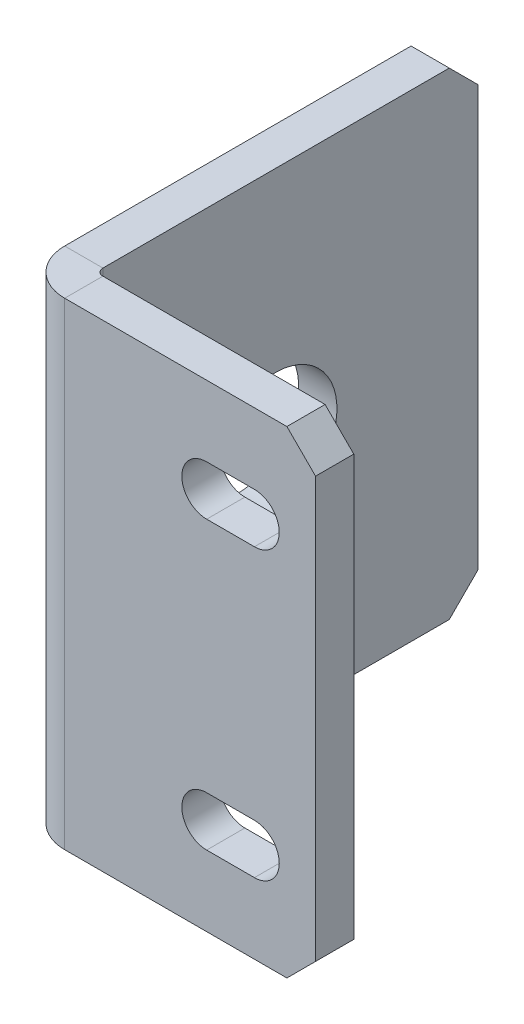
ISO-10303-21;
HEADER;
FILE_DESCRIPTION(('STEP AP214'),'2;1');
FILE_NAME('part.step','',(''),(''),'','','');
FILE_SCHEMA(('AUTOMOTIVE_DESIGN { 1 0 10303 214 1 1 1 1 }'));
ENDSEC;
DATA;
#1=APPLICATION_CONTEXT('core data for automotive mechanical design processes');
#2=APPLICATION_PROTOCOL_DEFINITION('international standard','automotive_design',2000,#1);
#3=PRODUCT_CONTEXT('',#1,'mechanical');
#4=PRODUCT('Part','Part','',(#3));
#5=PRODUCT_RELATED_PRODUCT_CATEGORY('part','',(#4));
#6=PRODUCT_DEFINITION_FORMATION('','',#4);
#7=PRODUCT_DEFINITION_CONTEXT('part definition',#1,'design');
#8=PRODUCT_DEFINITION('design','',#6,#7);
#9=PRODUCT_DEFINITION_SHAPE('','',#8);
#10=(LENGTH_UNIT() NAMED_UNIT(*) SI_UNIT(.MILLI.,.METRE.));
#11=(NAMED_UNIT(*) PLANE_ANGLE_UNIT() SI_UNIT($,.RADIAN.));
#12=(NAMED_UNIT(*) SI_UNIT($,.STERADIAN.) SOLID_ANGLE_UNIT());
#13=UNCERTAINTY_MEASURE_WITH_UNIT(LENGTH_MEASURE(1.E-05),#10,'distance_accuracy_value','');
#14=(GEOMETRIC_REPRESENTATION_CONTEXT(3) GLOBAL_UNCERTAINTY_ASSIGNED_CONTEXT((#13)) GLOBAL_UNIT_ASSIGNED_CONTEXT((#10,
#11,#12)) REPRESENTATION_CONTEXT('',''));
#15=CARTESIAN_POINT('',(0.,0.,0.));
#16=DIRECTION('',(0.,0.,1.));
#17=DIRECTION('',(1.,0.,0.));
#18=AXIS2_PLACEMENT_3D('',#15,#16,#17);
#19=CARTESIAN_POINT('',(0.,50.,-4.7366));
#20=DIRECTION('',(0.,1.,0.));
#21=DIRECTION('',(0.,0.,1.));
#22=AXIS2_PLACEMENT_3D('',#19,#20,#21);
#23=PLANE('',#22);
#24=DIRECTION('',(1.,0.,0.));
#25=VECTOR('',#24,1.);
#26=CARTESIAN_POINT('',(0.,50.,-4.7366));
#27=LINE('',#26,#25);
#28=CARTESIAN_POINT('',(0.,50.,-4.7366));
#29=VERTEX_POINT('',#28);
#30=CARTESIAN_POINT('',(4.,50.,-4.7366));
#31=VERTEX_POINT('',#30);
#32=EDGE_CURVE('E297',#29,#31,#27,.T.);
#33=ORIENTED_EDGE('',*,*,#32,.F.);
#34=CARTESIAN_POINT('',(4.7366,50.,-4.7366));
#35=DIRECTION('',(0.,1.,0.));
#36=DIRECTION('',(0.,0.,1.));
#37=AXIS2_PLACEMENT_3D('',#34,#35,#36);
#38=CIRCLE('',#37,4.7366);
#39=CARTESIAN_POINT('',(4.7366,50.,0.));
#40=VERTEX_POINT('',#39);
#41=EDGE_CURVE('E241',#40,#29,#38,.F.);
#42=ORIENTED_EDGE('',*,*,#41,.F.);
#43=DIRECTION('',(0.,0.,1.));
#44=VECTOR('',#43,1.);
#45=CARTESIAN_POINT('',(4.7366,50.,-4.));
#46=LINE('',#45,#44);
#47=CARTESIAN_POINT('',(4.7366,50.,-4.));
#48=VERTEX_POINT('',#47);
#49=EDGE_CURVE('E294',#48,#40,#46,.T.);
#50=ORIENTED_EDGE('',*,*,#49,.F.);
#51=CARTESIAN_POINT('',(4.7366,50.,-4.7366));
#52=DIRECTION('',(0.,1.,0.));
#53=DIRECTION('',(1.,0.,0.));
#54=AXIS2_PLACEMENT_3D('',#51,#52,#53);
#55=CIRCLE('',#54,0.7366);
#56=EDGE_CURVE('E248',#48,#31,#55,.F.);
#57=ORIENTED_EDGE('',*,*,#56,.T.);
#58=EDGE_LOOP('',(#33,#42,#50,#57));
#59=FACE_BOUND('',#58,.T.);
#60=ADVANCED_FACE('F41',(#59),#23,.T.);
#61=CARTESIAN_POINT('',(4.7366,50.,-4.));
#62=DIRECTION('',(0.,1.,0.));
#63=DIRECTION('',(0.,0.,1.));
#64=AXIS2_PLACEMENT_3D('',#61,#62,#63);
#65=PLANE('',#64);
#66=DIRECTION('',(0.,0.,-1.));
#67=VECTOR('',#66,1.);
#68=CARTESIAN_POINT('',(4.,50.,0.));
#69=LINE('',#68,#67);
#70=CARTESIAN_POINT('',(4.,50.,-41.));
#71=VERTEX_POINT('',#70);
#72=EDGE_CURVE('E234',#31,#71,#69,.T.);
#73=ORIENTED_EDGE('',*,*,#72,.T.);
#74=DIRECTION('',(-1.,0.,0.));
#75=VECTOR('',#74,1.);
#76=CARTESIAN_POINT('',(4.7366,50.,-41.));
#77=LINE('',#76,#75);
#78=CARTESIAN_POINT('',(0.,50.,-41.));
#79=VERTEX_POINT('',#78);
#80=EDGE_CURVE('E308',#71,#79,#77,.T.);
#81=ORIENTED_EDGE('',*,*,#80,.T.);
#82=DIRECTION('',(0.,0.,-1.));
#83=VECTOR('',#82,1.);
#84=CARTESIAN_POINT('',(0.,50.,0.));
#85=LINE('',#84,#83);
#86=EDGE_CURVE('E237',#29,#79,#85,.T.);
#87=ORIENTED_EDGE('',*,*,#86,.F.);
#88=ORIENTED_EDGE('',*,*,#32,.T.);
#89=EDGE_LOOP('',(#73,#81,#87,#88));
#90=FACE_BOUND('',#89,.T.);
#91=ADVANCED_FACE('F371',(#90),#65,.T.);
#92=CARTESIAN_POINT('',(4.7366,0.,0.));
#93=DIRECTION('',(0.,-1.,0.));
#94=DIRECTION('',(0.,0.,-1.));
#95=AXIS2_PLACEMENT_3D('',#92,#93,#94);
#96=PLANE('',#95);
#97=DIRECTION('',(0.,0.,-1.));
#98=VECTOR('',#97,1.);
#99=CARTESIAN_POINT('',(4.7366,0.,0.));
#100=LINE('',#99,#98);
#101=CARTESIAN_POINT('',(4.7366,0.,0.));
#102=VERTEX_POINT('',#101);
#103=CARTESIAN_POINT('',(4.7366,0.,-4.));
#104=VERTEX_POINT('',#103);
#105=EDGE_CURVE('E291',#102,#104,#100,.T.);
#106=ORIENTED_EDGE('',*,*,#105,.F.);
#107=CARTESIAN_POINT('',(4.7366,0.,-4.7366));
#108=DIRECTION('',(0.,1.,0.));
#109=DIRECTION('',(0.,0.,1.));
#110=AXIS2_PLACEMENT_3D('',#107,#108,#109);
#111=CIRCLE('',#110,4.7366);
#112=CARTESIAN_POINT('',(0.,0.,-4.7366));
#113=VERTEX_POINT('',#112);
#114=EDGE_CURVE('E257',#102,#113,#111,.F.);
#115=ORIENTED_EDGE('',*,*,#114,.T.);
#116=DIRECTION('',(-1.,0.,0.));
#117=VECTOR('',#116,1.);
#118=CARTESIAN_POINT('',(4.,0.,-4.7366));
#119=LINE('',#118,#117);
#120=CARTESIAN_POINT('',(4.,0.,-4.7366));
#121=VERTEX_POINT('',#120);
#122=EDGE_CURVE('E289',#121,#113,#119,.T.);
#123=ORIENTED_EDGE('',*,*,#122,.F.);
#124=CARTESIAN_POINT('',(4.7366,0.,-4.7366));
#125=DIRECTION('',(0.,1.,0.));
#126=DIRECTION('',(1.,0.,0.));
#127=AXIS2_PLACEMENT_3D('',#124,#125,#126);
#128=CIRCLE('',#127,0.7366);
#129=EDGE_CURVE('E238',#104,#121,#128,.F.);
#130=ORIENTED_EDGE('',*,*,#129,.F.);
#131=EDGE_LOOP('',(#106,#115,#123,#130));
#132=FACE_BOUND('',#131,.T.);
#133=ADVANCED_FACE('F377',(#132),#96,.T.);
#134=CARTESIAN_POINT('',(4.,0.,-4.7366));
#135=DIRECTION('',(0.,-1.,0.));
#136=DIRECTION('',(0.,0.,-1.));
#137=AXIS2_PLACEMENT_3D('',#134,#135,#136);
#138=PLANE('',#137);
#139=DIRECTION('',(1.,0.,0.));
#140=VECTOR('',#139,1.);
#141=CARTESIAN_POINT('',(0.,0.,-4.));
#142=LINE('',#141,#140);
#143=CARTESIAN_POINT('',(28.,0.,-4.));
#144=VERTEX_POINT('',#143);
#145=EDGE_CURVE('E262',#144,#104,#142,.F.);
#146=ORIENTED_EDGE('',*,*,#145,.F.);
#147=DIRECTION('',(0.,0.,1.));
#148=VECTOR('',#147,1.);
#149=CARTESIAN_POINT('',(28.,0.,-4.7366));
#150=LINE('',#149,#148);
#151=CARTESIAN_POINT('',(28.,0.,0.));
#152=VERTEX_POINT('',#151);
#153=EDGE_CURVE('E332',#144,#152,#150,.T.);
#154=ORIENTED_EDGE('',*,*,#153,.T.);
#155=DIRECTION('',(-1.,0.,0.));
#156=VECTOR('',#155,1.);
#157=CARTESIAN_POINT('',(0.,0.,0.));
#158=LINE('',#157,#156);
#159=EDGE_CURVE('E260',#152,#102,#158,.T.);
#160=ORIENTED_EDGE('',*,*,#159,.T.);
#161=ORIENTED_EDGE('',*,*,#105,.T.);
#162=EDGE_LOOP('',(#146,#154,#160,#161));
#163=FACE_BOUND('',#162,.T.);
#164=ADVANCED_FACE('F422',(#163),#138,.T.);
#165=CARTESIAN_POINT('',(4.,50.,0.));
#166=DIRECTION('',(-1.,0.,0.));
#167=DIRECTION('',(0.,0.,1.));
#168=AXIS2_PLACEMENT_3D('',#165,#166,#167);
#169=PLANE('',#168);
#170=CARTESIAN_POINT('',(4.,25.,-22.7366));
#171=DIRECTION('',(-1.,0.,0.));
#172=DIRECTION('',(0.,0.,1.));
#173=AXIS2_PLACEMENT_3D('',#170,#171,#172);
#174=CIRCLE('',#173,6.50000000000001);
#175=CARTESIAN_POINT('',(4.,25.,-16.2366));
#176=VERTEX_POINT('',#175);
#177=EDGE_CURVE('E230',#176,#176,#174,.T.);
#178=ORIENTED_EDGE('',*,*,#177,.T.);
#179=EDGE_LOOP('',(#178));
#180=FACE_BOUND('',#179,.T.);
#181=DIRECTION('',(0.,-1.,0.));
#182=VECTOR('',#181,1.);
#183=CARTESIAN_POINT('',(4.,50.,-44.));
#184=LINE('',#183,#182);
#185=CARTESIAN_POINT('',(4.,47.,-44.));
#186=VERTEX_POINT('',#185);
#187=CARTESIAN_POINT('',(4.,3.00000000000002,-44.));
#188=VERTEX_POINT('',#187);
#189=EDGE_CURVE('E286',#186,#188,#184,.T.);
#190=ORIENTED_EDGE('',*,*,#189,.F.);
#191=DIRECTION('',(0.,-0.707106781186548,-0.707106781186548));
#192=VECTOR('',#191,1.);
#193=CARTESIAN_POINT('',(4.,47.,-44.));
#194=LINE('',#193,#192);
#195=EDGE_CURVE('E306',#186,#71,#194,.F.);
#196=ORIENTED_EDGE('',*,*,#195,.T.);
#197=ORIENTED_EDGE('',*,*,#72,.F.);
#198=DIRECTION('',(0.,-1.,0.));
#199=VECTOR('',#198,1.);
#200=CARTESIAN_POINT('',(4.,50.,-4.7366));
#201=LINE('',#200,#199);
#202=EDGE_CURVE('E251',#31,#121,#201,.T.);
#203=ORIENTED_EDGE('',*,*,#202,.T.);
#204=DIRECTION('',(0.,0.,-1.));
#205=VECTOR('',#204,1.);
#206=CARTESIAN_POINT('',(4.,0.,0.));
#207=LINE('',#206,#205);
#208=CARTESIAN_POINT('',(4.,0.,-41.));
#209=VERTEX_POINT('',#208);
#210=EDGE_CURVE('E233',#121,#209,#207,.T.);
#211=ORIENTED_EDGE('',*,*,#210,.T.);
#212=DIRECTION('',(0.,0.707106781186548,-0.707106781186547));
#213=VECTOR('',#212,1.);
#214=CARTESIAN_POINT('',(4.,0.,-41.));
#215=LINE('',#214,#213);
#216=EDGE_CURVE('E304',#209,#188,#215,.T.);
#217=ORIENTED_EDGE('',*,*,#216,.T.);
#218=EDGE_LOOP('',(#190,#196,#197,#203,#211,#217));
#219=FACE_BOUND('',#218,.T.);
#220=ADVANCED_FACE('F450',(#180,#219),#169,.F.);
#221=CARTESIAN_POINT('',(0.,50.,-44.));
#222=DIRECTION('',(0.,0.,-1.));
#223=DIRECTION('',(-1.,0.,0.));
#224=AXIS2_PLACEMENT_3D('',#221,#222,#223);
#225=PLANE('',#224);
#226=DIRECTION('',(0.,-1.,0.));
#227=VECTOR('',#226,1.);
#228=CARTESIAN_POINT('',(0.,50.,-44.));
#229=LINE('',#228,#227);
#230=CARTESIAN_POINT('',(0.,47.,-44.));
#231=VERTEX_POINT('',#230);
#232=CARTESIAN_POINT('',(0.,3.00000000000002,-44.));
#233=VERTEX_POINT('',#232);
#234=EDGE_CURVE('E283',#231,#233,#229,.T.);
#235=ORIENTED_EDGE('',*,*,#234,.F.);
#236=DIRECTION('',(1.,0.,0.));
#237=VECTOR('',#236,1.);
#238=CARTESIAN_POINT('',(0.,47.,-44.));
#239=LINE('',#238,#237);
#240=EDGE_CURVE('E301',#231,#186,#239,.T.);
#241=ORIENTED_EDGE('',*,*,#240,.T.);
#242=ORIENTED_EDGE('',*,*,#189,.T.);
#243=DIRECTION('',(-1.,0.,0.));
#244=VECTOR('',#243,1.);
#245=CARTESIAN_POINT('',(0.,3.00000000000002,-44.));
#246=LINE('',#245,#244);
#247=EDGE_CURVE('E299',#188,#233,#246,.T.);
#248=ORIENTED_EDGE('',*,*,#247,.T.);
#249=EDGE_LOOP('',(#235,#241,#242,#248));
#250=FACE_BOUND('',#249,.T.);
#251=ADVANCED_FACE('F456',(#250),#225,.T.);
#252=CARTESIAN_POINT('',(0.,50.,0.));
#253=DIRECTION('',(-1.,0.,0.));
#254=DIRECTION('',(0.,0.,1.));
#255=AXIS2_PLACEMENT_3D('',#252,#253,#254);
#256=PLANE('',#255);
#257=CARTESIAN_POINT('',(0.,25.,-22.7366));
#258=DIRECTION('',(-1.,0.,0.));
#259=DIRECTION('',(0.,0.,1.));
#260=AXIS2_PLACEMENT_3D('',#257,#258,#259);
#261=CIRCLE('',#260,6.50000000000001);
#262=CARTESIAN_POINT('',(0.,25.,-16.2366));
#263=VERTEX_POINT('',#262);
#264=EDGE_CURVE('E221',#263,#263,#261,.T.);
#265=ORIENTED_EDGE('',*,*,#264,.F.);
#266=EDGE_LOOP('',(#265));
#267=FACE_BOUND('',#266,.T.);
#268=ORIENTED_EDGE('',*,*,#86,.T.);
#269=DIRECTION('',(0.,0.707106781186548,0.707106781186548));
#270=VECTOR('',#269,1.);
#271=CARTESIAN_POINT('',(0.,70.5,-20.5));
#272=LINE('',#271,#270);
#273=EDGE_CURVE('E312',#79,#231,#272,.F.);
#274=ORIENTED_EDGE('',*,*,#273,.T.);
#275=ORIENTED_EDGE('',*,*,#234,.T.);
#276=DIRECTION('',(0.,-0.707106781186548,0.707106781186547));
#277=VECTOR('',#276,1.);
#278=CARTESIAN_POINT('',(0.,4.50000000000007,-45.5));
#279=LINE('',#278,#277);
#280=CARTESIAN_POINT('',(0.,0.,-41.));
#281=VERTEX_POINT('',#280);
#282=EDGE_CURVE('E310',#233,#281,#279,.T.);
#283=ORIENTED_EDGE('',*,*,#282,.T.);
#284=DIRECTION('',(0.,0.,-1.));
#285=VECTOR('',#284,1.);
#286=CARTESIAN_POINT('',(0.,0.,0.));
#287=LINE('',#286,#285);
#288=EDGE_CURVE('E254',#113,#281,#287,.T.);
#289=ORIENTED_EDGE('',*,*,#288,.F.);
#290=DIRECTION('',(0.,-1.,0.));
#291=VECTOR('',#290,1.);
#292=CARTESIAN_POINT('',(0.,50.,-4.7366));
#293=LINE('',#292,#291);
#294=EDGE_CURVE('E280',#29,#113,#293,.T.);
#295=ORIENTED_EDGE('',*,*,#294,.F.);
#296=EDGE_LOOP('',(#268,#274,#275,#283,#289,#295));
#297=FACE_BOUND('',#296,.T.);
#298=ADVANCED_FACE('F444',(#267,#297),#256,.T.);
#299=CARTESIAN_POINT('',(4.7366,50.,-4.7366));
#300=DIRECTION('',(0.,-1.,0.));
#301=DIRECTION('',(0.,0.,-1.));
#302=AXIS2_PLACEMENT_3D('',#299,#300,#301);
#303=CYLINDRICAL_SURFACE('',#302,4.7366);
#304=ORIENTED_EDGE('',*,*,#114,.F.);
#305=DIRECTION('',(0.,-1.,0.));
#306=VECTOR('',#305,1.);
#307=CARTESIAN_POINT('',(4.7366,50.,0.));
#308=LINE('',#307,#306);
#309=EDGE_CURVE('E277',#40,#102,#308,.T.);
#310=ORIENTED_EDGE('',*,*,#309,.F.);
#311=ORIENTED_EDGE('',*,*,#41,.T.);
#312=ORIENTED_EDGE('',*,*,#294,.T.);
#313=EDGE_LOOP('',(#304,#310,#311,#312));
#314=FACE_BOUND('',#313,.T.);
#315=ADVANCED_FACE('F439',(#314),#303,.T.);
#316=CARTESIAN_POINT('',(0.,50.,0.));
#317=DIRECTION('',(0.,0.,1.));
#318=DIRECTION('',(1.,0.,0.));
#319=AXIS2_PLACEMENT_3D('',#316,#317,#318);
#320=PLANE('',#319);
#321=CARTESIAN_POINT('',(24.6,40.,0.));
#322=DIRECTION('',(0.,0.,1.));
#323=DIRECTION('',(1.,0.,0.));
#324=AXIS2_PLACEMENT_3D('',#321,#322,#323);
#325=CIRCLE('',#324,2.6);
#326=CARTESIAN_POINT('',(24.6,37.4,0.));
#327=VERTEX_POINT('',#326);
#328=CARTESIAN_POINT('',(24.6,42.6,0.));
#329=VERTEX_POINT('',#328);
#330=EDGE_CURVE('E57',#327,#329,#325,.T.);
#331=ORIENTED_EDGE('',*,*,#330,.F.);
#332=DIRECTION('',(1.,0.,0.));
#333=VECTOR('',#332,1.);
#334=CARTESIAN_POINT('',(24.6,37.4,0.));
#335=LINE('',#334,#333);
#336=CARTESIAN_POINT('',(19.6,37.4,0.));
#337=VERTEX_POINT('',#336);
#338=EDGE_CURVE('E198',#337,#327,#335,.T.);
#339=ORIENTED_EDGE('',*,*,#338,.F.);
#340=CARTESIAN_POINT('',(19.6,40.,0.));
#341=DIRECTION('',(0.,0.,1.));
#342=DIRECTION('',(1.,0.,0.));
#343=AXIS2_PLACEMENT_3D('',#340,#341,#342);
#344=CIRCLE('',#343,2.6);
#345=CARTESIAN_POINT('',(19.6,42.6,0.));
#346=VERTEX_POINT('',#345);
#347=EDGE_CURVE('E182',#346,#337,#344,.T.);
#348=ORIENTED_EDGE('',*,*,#347,.F.);
#349=DIRECTION('',(-1.,0.,0.));
#350=VECTOR('',#349,1.);
#351=CARTESIAN_POINT('',(24.6,42.6,0.));
#352=LINE('',#351,#350);
#353=EDGE_CURVE('E191',#329,#346,#352,.T.);
#354=ORIENTED_EDGE('',*,*,#353,.F.);
#355=EDGE_LOOP('',(#331,#339,#348,#354));
#356=FACE_BOUND('',#355,.T.);
#357=CARTESIAN_POINT('',(24.6,10.,0.));
#358=DIRECTION('',(0.,0.,1.));
#359=DIRECTION('',(1.,0.,0.));
#360=AXIS2_PLACEMENT_3D('',#357,#358,#359);
#361=CIRCLE('',#360,2.6);
#362=CARTESIAN_POINT('',(24.6,7.4,0.));
#363=VERTEX_POINT('',#362);
#364=CARTESIAN_POINT('',(24.6,12.6,0.));
#365=VERTEX_POINT('',#364);
#366=EDGE_CURVE('E205',#363,#365,#361,.T.);
#367=ORIENTED_EDGE('',*,*,#366,.F.);
#368=DIRECTION('',(1.,0.,0.));
#369=VECTOR('',#368,1.);
#370=CARTESIAN_POINT('',(24.6,7.4,0.));
#371=LINE('',#370,#369);
#372=CARTESIAN_POINT('',(19.6,7.4,0.));
#373=VERTEX_POINT('',#372);
#374=EDGE_CURVE('E215',#373,#363,#371,.T.);
#375=ORIENTED_EDGE('',*,*,#374,.F.);
#376=CARTESIAN_POINT('',(19.6,10.,0.));
#377=DIRECTION('',(0.,0.,1.));
#378=DIRECTION('',(1.,0.,0.));
#379=AXIS2_PLACEMENT_3D('',#376,#377,#378);
#380=CIRCLE('',#379,2.6);
#381=CARTESIAN_POINT('',(19.6,12.6,0.));
#382=VERTEX_POINT('',#381);
#383=EDGE_CURVE('E212',#382,#373,#380,.T.);
#384=ORIENTED_EDGE('',*,*,#383,.F.);
#385=DIRECTION('',(-1.,0.,0.));
#386=VECTOR('',#385,1.);
#387=CARTESIAN_POINT('',(24.6,12.6,0.));
#388=LINE('',#387,#386);
#389=EDGE_CURVE('E209',#365,#382,#388,.T.);
#390=ORIENTED_EDGE('',*,*,#389,.F.);
#391=EDGE_LOOP('',(#367,#375,#384,#390));
#392=FACE_BOUND('',#391,.T.);
#393=DIRECTION('',(0.,-1.,0.));
#394=VECTOR('',#393,1.);
#395=CARTESIAN_POINT('',(31.,50.,0.));
#396=LINE('',#395,#394);
#397=CARTESIAN_POINT('',(31.,47.,0.));
#398=VERTEX_POINT('',#397);
#399=CARTESIAN_POINT('',(31.,3.00000000000002,0.));
#400=VERTEX_POINT('',#399);
#401=EDGE_CURVE('E274',#398,#400,#396,.T.);
#402=ORIENTED_EDGE('',*,*,#401,.F.);
#403=DIRECTION('',(0.707106781186548,-0.707106781186547,0.));
#404=VECTOR('',#403,1.);
#405=CARTESIAN_POINT('',(14.,64.,0.));
#406=LINE('',#405,#404);
#407=CARTESIAN_POINT('',(28.,50.,0.));
#408=VERTEX_POINT('',#407);
#409=EDGE_CURVE('E324',#398,#408,#406,.F.);
#410=ORIENTED_EDGE('',*,*,#409,.T.);
#411=DIRECTION('',(-1.,0.,0.));
#412=VECTOR('',#411,1.);
#413=CARTESIAN_POINT('',(0.,50.,0.));
#414=LINE('',#413,#412);
#415=EDGE_CURVE('E244',#408,#40,#414,.T.);
#416=ORIENTED_EDGE('',*,*,#415,.T.);
#417=ORIENTED_EDGE('',*,*,#309,.T.);
#418=ORIENTED_EDGE('',*,*,#159,.F.);
#419=DIRECTION('',(-0.707106781186546,-0.707106781186549,0.));
#420=VECTOR('',#419,1.);
#421=CARTESIAN_POINT('',(39.0000000000001,11.0000000000001,0.));
#422=LINE('',#421,#420);
#423=EDGE_CURVE('E322',#152,#400,#422,.F.);
#424=ORIENTED_EDGE('',*,*,#423,.T.);
#425=EDGE_LOOP('',(#402,#410,#416,#417,#418,#424));
#426=FACE_BOUND('',#425,.T.);
#427=ADVANCED_FACE('F195',(#356,#392,#426),#320,.T.);
#428=CARTESIAN_POINT('',(31.,50.,-4.));
#429=DIRECTION('',(1.,0.,0.));
#430=DIRECTION('',(0.,0.,-1.));
#431=AXIS2_PLACEMENT_3D('',#428,#429,#430);
#432=PLANE('',#431);
#433=DIRECTION('',(0.,-1.,0.));
#434=VECTOR('',#433,1.);
#435=CARTESIAN_POINT('',(31.,50.,-4.));
#436=LINE('',#435,#434);
#437=CARTESIAN_POINT('',(31.,47.,-4.));
#438=VERTEX_POINT('',#437);
#439=CARTESIAN_POINT('',(31.,3.00000000000002,-4.));
#440=VERTEX_POINT('',#439);
#441=EDGE_CURVE('E271',#438,#440,#436,.T.);
#442=ORIENTED_EDGE('',*,*,#441,.F.);
#443=DIRECTION('',(0.,0.,1.));
#444=VECTOR('',#443,1.);
#445=CARTESIAN_POINT('',(31.,47.,-4.));
#446=LINE('',#445,#444);
#447=EDGE_CURVE('E319',#438,#398,#446,.T.);
#448=ORIENTED_EDGE('',*,*,#447,.T.);
#449=ORIENTED_EDGE('',*,*,#401,.T.);
#450=DIRECTION('',(0.,0.,-1.));
#451=VECTOR('',#450,1.);
#452=CARTESIAN_POINT('',(31.,3.00000000000002,-4.));
#453=LINE('',#452,#451);
#454=EDGE_CURVE('E317',#400,#440,#453,.T.);
#455=ORIENTED_EDGE('',*,*,#454,.T.);
#456=EDGE_LOOP('',(#442,#448,#449,#455));
#457=FACE_BOUND('',#456,.T.);
#458=ADVANCED_FACE('F416',(#457),#432,.T.);
#459=CARTESIAN_POINT('',(0.,50.,-4.));
#460=DIRECTION('',(0.,0.,1.));
#461=DIRECTION('',(1.,0.,0.));
#462=AXIS2_PLACEMENT_3D('',#459,#460,#461);
#463=PLANE('',#462);
#464=DIRECTION('',(1.,0.,0.));
#465=VECTOR('',#464,1.);
#466=CARTESIAN_POINT('',(0.,37.4,-4.));
#467=LINE('',#466,#465);
#468=CARTESIAN_POINT('',(19.6,37.4,-4.));
#469=VERTEX_POINT('',#468);
#470=CARTESIAN_POINT('',(24.6,37.4,-4.));
#471=VERTEX_POINT('',#470);
#472=EDGE_CURVE('E50',#469,#471,#467,.T.);
#473=ORIENTED_EDGE('',*,*,#472,.T.);
#474=CARTESIAN_POINT('',(24.6,40.,-4.));
#475=DIRECTION('',(0.,0.,1.));
#476=DIRECTION('',(1.,0.,0.));
#477=AXIS2_PLACEMENT_3D('',#474,#475,#476);
#478=CIRCLE('',#477,2.6);
#479=CARTESIAN_POINT('',(24.6,42.6,-4.));
#480=VERTEX_POINT('',#479);
#481=EDGE_CURVE('E11',#471,#480,#478,.T.);
#482=ORIENTED_EDGE('',*,*,#481,.T.);
#483=DIRECTION('',(-1.,0.,0.));
#484=VECTOR('',#483,1.);
#485=CARTESIAN_POINT('',(0.,42.6,-4.));
#486=LINE('',#485,#484);
#487=CARTESIAN_POINT('',(19.6,42.6,-4.));
#488=VERTEX_POINT('',#487);
#489=EDGE_CURVE('E347',#480,#488,#486,.T.);
#490=ORIENTED_EDGE('',*,*,#489,.T.);
#491=CARTESIAN_POINT('',(19.6,40.,-4.));
#492=DIRECTION('',(0.,0.,1.));
#493=DIRECTION('',(1.,0.,0.));
#494=AXIS2_PLACEMENT_3D('',#491,#492,#493);
#495=CIRCLE('',#494,2.6);
#496=EDGE_CURVE('E185',#488,#469,#495,.T.);
#497=ORIENTED_EDGE('',*,*,#496,.T.);
#498=EDGE_LOOP('',(#473,#482,#490,#497));
#499=FACE_BOUND('',#498,.T.);
#500=DIRECTION('',(1.,0.,0.));
#501=VECTOR('',#500,1.);
#502=CARTESIAN_POINT('',(0.,7.4,-4.));
#503=LINE('',#502,#501);
#504=CARTESIAN_POINT('',(19.6,7.4,-4.));
#505=VERTEX_POINT('',#504);
#506=CARTESIAN_POINT('',(24.6,7.4,-4.));
#507=VERTEX_POINT('',#506);
#508=EDGE_CURVE('E341',#505,#507,#503,.T.);
#509=ORIENTED_EDGE('',*,*,#508,.T.);
#510=CARTESIAN_POINT('',(24.6,10.,-4.));
#511=DIRECTION('',(0.,0.,1.));
#512=DIRECTION('',(1.,0.,0.));
#513=AXIS2_PLACEMENT_3D('',#510,#511,#512);
#514=CIRCLE('',#513,2.6);
#515=CARTESIAN_POINT('',(24.6,12.6,-4.));
#516=VERTEX_POINT('',#515);
#517=EDGE_CURVE('E344',#507,#516,#514,.T.);
#518=ORIENTED_EDGE('',*,*,#517,.T.);
#519=DIRECTION('',(-1.,0.,0.));
#520=VECTOR('',#519,1.);
#521=CARTESIAN_POINT('',(0.,12.6,-4.));
#522=LINE('',#521,#520);
#523=CARTESIAN_POINT('',(19.6,12.6,-4.));
#524=VERTEX_POINT('',#523);
#525=EDGE_CURVE('E335',#516,#524,#522,.T.);
#526=ORIENTED_EDGE('',*,*,#525,.T.);
#527=CARTESIAN_POINT('',(19.6,10.,-4.));
#528=DIRECTION('',(0.,0.,1.));
#529=DIRECTION('',(1.,0.,0.));
#530=AXIS2_PLACEMENT_3D('',#527,#528,#529);
#531=CIRCLE('',#530,2.6);
#532=EDGE_CURVE('E338',#524,#505,#531,.T.);
#533=ORIENTED_EDGE('',*,*,#532,.T.);
#534=EDGE_LOOP('',(#509,#518,#526,#533));
#535=FACE_BOUND('',#534,.T.);
#536=DIRECTION('',(1.,0.,0.));
#537=VECTOR('',#536,1.);
#538=CARTESIAN_POINT('',(0.,50.,-4.));
#539=LINE('',#538,#537);
#540=CARTESIAN_POINT('',(28.,50.,-4.));
#541=VERTEX_POINT('',#540);
#542=EDGE_CURVE('E246',#541,#48,#539,.F.);
#543=ORIENTED_EDGE('',*,*,#542,.F.);
#544=DIRECTION('',(-0.707106781186548,0.707106781186547,0.));
#545=VECTOR('',#544,1.);
#546=CARTESIAN_POINT('',(31.,47.,-4.));
#547=LINE('',#546,#545);
#548=EDGE_CURVE('E330',#541,#438,#547,.F.);
#549=ORIENTED_EDGE('',*,*,#548,.T.);
#550=ORIENTED_EDGE('',*,*,#441,.T.);
#551=DIRECTION('',(0.707106781186546,0.707106781186549,0.));
#552=VECTOR('',#551,1.);
#553=CARTESIAN_POINT('',(28.,0.,-4.));
#554=LINE('',#553,#552);
#555=EDGE_CURVE('E328',#440,#144,#554,.F.);
#556=ORIENTED_EDGE('',*,*,#555,.T.);
#557=ORIENTED_EDGE('',*,*,#145,.T.);
#558=DIRECTION('',(0.,-1.,0.));
#559=VECTOR('',#558,1.);
#560=CARTESIAN_POINT('',(4.7366,50.,-4.));
#561=LINE('',#560,#559);
#562=EDGE_CURVE('E268',#48,#104,#561,.T.);
#563=ORIENTED_EDGE('',*,*,#562,.F.);
#564=EDGE_LOOP('',(#543,#549,#550,#556,#557,#563));
#565=FACE_BOUND('',#564,.T.);
#566=ADVANCED_FACE('F351',(#499,#535,#565),#463,.F.);
#567=CARTESIAN_POINT('',(4.7366,50.,-4.7366));
#568=DIRECTION('',(0.,-1.,0.));
#569=DIRECTION('',(0.,0.,-1.));
#570=AXIS2_PLACEMENT_3D('',#567,#568,#569);
#571=CYLINDRICAL_SURFACE('',#570,0.7366);
#572=ORIENTED_EDGE('',*,*,#129,.T.);
#573=ORIENTED_EDGE('',*,*,#202,.F.);
#574=ORIENTED_EDGE('',*,*,#56,.F.);
#575=ORIENTED_EDGE('',*,*,#562,.T.);
#576=EDGE_LOOP('',(#572,#573,#574,#575));
#577=FACE_BOUND('',#576,.T.);
#578=ADVANCED_FACE('F429',(#577),#571,.F.);
#579=CARTESIAN_POINT('',(4.7366,50.,-4.7366));
#580=DIRECTION('',(0.,1.,0.));
#581=DIRECTION('',(1.,0.,0.));
#582=AXIS2_PLACEMENT_3D('',#579,#580,#581);
#583=PLANE('',#582);
#584=ORIENTED_EDGE('',*,*,#415,.F.);
#585=DIRECTION('',(0.,0.,-1.));
#586=VECTOR('',#585,1.);
#587=CARTESIAN_POINT('',(28.,50.,-4.7366));
#588=LINE('',#587,#586);
#589=EDGE_CURVE('E326',#408,#541,#588,.T.);
#590=ORIENTED_EDGE('',*,*,#589,.T.);
#591=ORIENTED_EDGE('',*,*,#542,.T.);
#592=ORIENTED_EDGE('',*,*,#49,.T.);
#593=EDGE_LOOP('',(#584,#590,#591,#592));
#594=FACE_BOUND('',#593,.T.);
#595=ADVANCED_FACE('F517',(#594),#583,.T.);
#596=CARTESIAN_POINT('',(4.7366,0.,-4.7366));
#597=DIRECTION('',(0.,1.,0.));
#598=DIRECTION('',(1.,0.,0.));
#599=AXIS2_PLACEMENT_3D('',#596,#597,#598);
#600=PLANE('',#599);
#601=ORIENTED_EDGE('',*,*,#288,.T.);
#602=DIRECTION('',(1.,0.,0.));
#603=VECTOR('',#602,1.);
#604=CARTESIAN_POINT('',(4.,0.,-41.));
#605=LINE('',#604,#603);
#606=EDGE_CURVE('E314',#281,#209,#605,.T.);
#607=ORIENTED_EDGE('',*,*,#606,.T.);
#608=ORIENTED_EDGE('',*,*,#210,.F.);
#609=ORIENTED_EDGE('',*,*,#122,.T.);
#610=EDGE_LOOP('',(#601,#607,#608,#609));
#611=FACE_BOUND('',#610,.T.);
#612=ADVANCED_FACE('F434',(#611),#600,.F.);
#613=CARTESIAN_POINT('',(31.,25.,-22.7366));
#614=DIRECTION('',(-1.,0.,0.));
#615=DIRECTION('',(0.,0.,1.));
#616=AXIS2_PLACEMENT_3D('',#613,#614,#615);
#617=CYLINDRICAL_SURFACE('',#616,6.50000000000001);
#618=ORIENTED_EDGE('',*,*,#264,.T.);
#619=EDGE_LOOP('',(#618));
#620=FACE_BOUND('',#619,.T.);
#621=ORIENTED_EDGE('',*,*,#177,.F.);
#622=EDGE_LOOP('',(#621));
#623=FACE_BOUND('',#622,.T.);
#624=ADVANCED_FACE('F390',(#620,#623),#617,.F.);
#625=CARTESIAN_POINT('',(0.,47.,-44.));
#626=DIRECTION('',(0.,-0.707106781186548,0.707106781186548));
#627=DIRECTION('',(1.,0.,0.));
#628=AXIS2_PLACEMENT_3D('',#625,#626,#627);
#629=PLANE('',#628);
#630=ORIENTED_EDGE('',*,*,#273,.F.);
#631=ORIENTED_EDGE('',*,*,#80,.F.);
#632=ORIENTED_EDGE('',*,*,#195,.F.);
#633=ORIENTED_EDGE('',*,*,#240,.F.);
#634=EDGE_LOOP('',(#630,#631,#632,#633));
#635=FACE_BOUND('',#634,.T.);
#636=ADVANCED_FACE('F383',(#635),#629,.F.);
#637=CARTESIAN_POINT('',(4.7366,0.,-41.));
#638=DIRECTION('',(0.,-0.707106781186547,-0.707106781186548));
#639=DIRECTION('',(-1.,0.,0.));
#640=AXIS2_PLACEMENT_3D('',#637,#638,#639);
#641=PLANE('',#640);
#642=ORIENTED_EDGE('',*,*,#282,.F.);
#643=ORIENTED_EDGE('',*,*,#247,.F.);
#644=ORIENTED_EDGE('',*,*,#216,.F.);
#645=ORIENTED_EDGE('',*,*,#606,.F.);
#646=EDGE_LOOP('',(#642,#643,#644,#645));
#647=FACE_BOUND('',#646,.T.);
#648=ADVANCED_FACE('F389',(#647),#641,.T.);
#649=CARTESIAN_POINT('',(31.,47.,-4.));
#650=DIRECTION('',(-0.707106781186547,-0.707106781186548,0.));
#651=DIRECTION('',(0.,0.,1.));
#652=AXIS2_PLACEMENT_3D('',#649,#650,#651);
#653=PLANE('',#652);
#654=ORIENTED_EDGE('',*,*,#548,.F.);
#655=ORIENTED_EDGE('',*,*,#589,.F.);
#656=ORIENTED_EDGE('',*,*,#409,.F.);
#657=ORIENTED_EDGE('',*,*,#447,.F.);
#658=EDGE_LOOP('',(#654,#655,#656,#657));
#659=FACE_BOUND('',#658,.T.);
#660=ADVANCED_FACE('F396',(#659),#653,.F.);
#661=CARTESIAN_POINT('',(28.,0.,-4.7366));
#662=DIRECTION('',(-0.707106781186549,0.707106781186546,0.));
#663=DIRECTION('',(0.,0.,1.));
#664=AXIS2_PLACEMENT_3D('',#661,#662,#663);
#665=PLANE('',#664);
#666=ORIENTED_EDGE('',*,*,#555,.F.);
#667=ORIENTED_EDGE('',*,*,#454,.F.);
#668=ORIENTED_EDGE('',*,*,#423,.F.);
#669=ORIENTED_EDGE('',*,*,#153,.F.);
#670=EDGE_LOOP('',(#666,#667,#668,#669));
#671=FACE_BOUND('',#670,.T.);
#672=ADVANCED_FACE('F44',(#671),#665,.F.);
#673=CARTESIAN_POINT('',(24.6,10.,-44.));
#674=DIRECTION('',(0.,0.,1.));
#675=DIRECTION('',(1.,0.,0.));
#676=AXIS2_PLACEMENT_3D('',#673,#674,#675);
#677=CYLINDRICAL_SURFACE('',#676,2.6);
#678=DIRECTION('',(0.,0.,1.));
#679=VECTOR('',#678,1.);
#680=CARTESIAN_POINT('',(24.6,7.4,-44.));
#681=LINE('',#680,#679);
#682=EDGE_CURVE('E219',#507,#363,#681,.T.);
#683=ORIENTED_EDGE('',*,*,#682,.T.);
#684=ORIENTED_EDGE('',*,*,#366,.T.);
#685=DIRECTION('',(0.,0.,1.));
#686=VECTOR('',#685,1.);
#687=CARTESIAN_POINT('',(24.6,12.6,-44.));
#688=LINE('',#687,#686);
#689=EDGE_CURVE('E218',#516,#365,#688,.T.);
#690=ORIENTED_EDGE('',*,*,#689,.F.);
#691=ORIENTED_EDGE('',*,*,#517,.F.);
#692=EDGE_LOOP('',(#683,#684,#690,#691));
#693=FACE_BOUND('',#692,.T.);
#694=ADVANCED_FACE('F405',(#693),#677,.F.);
#695=CARTESIAN_POINT('',(24.6,7.4,-44.));
#696=DIRECTION('',(0.,-1.,0.));
#697=DIRECTION('',(0.,0.,-1.));
#698=AXIS2_PLACEMENT_3D('',#695,#696,#697);
#699=PLANE('',#698);
#700=DIRECTION('',(0.,0.,1.));
#701=VECTOR('',#700,1.);
#702=CARTESIAN_POINT('',(19.6,7.4,-44.));
#703=LINE('',#702,#701);
#704=EDGE_CURVE('E222',#505,#373,#703,.T.);
#705=ORIENTED_EDGE('',*,*,#704,.T.);
#706=ORIENTED_EDGE('',*,*,#374,.T.);
#707=ORIENTED_EDGE('',*,*,#682,.F.);
#708=ORIENTED_EDGE('',*,*,#508,.F.);
#709=EDGE_LOOP('',(#705,#706,#707,#708));
#710=FACE_BOUND('',#709,.T.);
#711=ADVANCED_FACE('F567',(#710),#699,.F.);
#712=CARTESIAN_POINT('',(19.6,10.,-44.));
#713=DIRECTION('',(0.,0.,1.));
#714=DIRECTION('',(1.,0.,0.));
#715=AXIS2_PLACEMENT_3D('',#712,#713,#714);
#716=CYLINDRICAL_SURFACE('',#715,2.6);
#717=DIRECTION('',(0.,0.,1.));
#718=VECTOR('',#717,1.);
#719=CARTESIAN_POINT('',(19.6,12.6,-44.));
#720=LINE('',#719,#718);
#721=EDGE_CURVE('E224',#524,#382,#720,.T.);
#722=ORIENTED_EDGE('',*,*,#721,.T.);
#723=ORIENTED_EDGE('',*,*,#383,.T.);
#724=ORIENTED_EDGE('',*,*,#704,.F.);
#725=ORIENTED_EDGE('',*,*,#532,.F.);
#726=EDGE_LOOP('',(#722,#723,#724,#725));
#727=FACE_BOUND('',#726,.T.);
#728=ADVANCED_FACE('F365',(#727),#716,.F.);
#729=CARTESIAN_POINT('',(24.6,12.6,-44.));
#730=DIRECTION('',(0.,1.,0.));
#731=DIRECTION('',(0.,0.,1.));
#732=AXIS2_PLACEMENT_3D('',#729,#730,#731);
#733=PLANE('',#732);
#734=ORIENTED_EDGE('',*,*,#689,.T.);
#735=ORIENTED_EDGE('',*,*,#389,.T.);
#736=ORIENTED_EDGE('',*,*,#721,.F.);
#737=ORIENTED_EDGE('',*,*,#525,.F.);
#738=EDGE_LOOP('',(#734,#735,#736,#737));
#739=FACE_BOUND('',#738,.T.);
#740=ADVANCED_FACE('F358',(#739),#733,.F.);
#741=CARTESIAN_POINT('',(24.6,40.,-44.));
#742=DIRECTION('',(0.,0.,1.));
#743=DIRECTION('',(1.,0.,0.));
#744=AXIS2_PLACEMENT_3D('',#741,#742,#743);
#745=CYLINDRICAL_SURFACE('',#744,2.6);
#746=DIRECTION('',(0.,0.,1.));
#747=VECTOR('',#746,1.);
#748=CARTESIAN_POINT('',(24.6,37.4,-44.));
#749=LINE('',#748,#747);
#750=EDGE_CURVE('E203',#471,#327,#749,.T.);
#751=ORIENTED_EDGE('',*,*,#750,.T.);
#752=ORIENTED_EDGE('',*,*,#330,.T.);
#753=DIRECTION('',(0.,0.,1.));
#754=VECTOR('',#753,1.);
#755=CARTESIAN_POINT('',(24.6,42.6,-44.));
#756=LINE('',#755,#754);
#757=EDGE_CURVE('E188',#480,#329,#756,.T.);
#758=ORIENTED_EDGE('',*,*,#757,.F.);
#759=ORIENTED_EDGE('',*,*,#481,.F.);
#760=EDGE_LOOP('',(#751,#752,#758,#759));
#761=FACE_BOUND('',#760,.T.);
#762=ADVANCED_FACE('F356',(#761),#745,.F.);
#763=CARTESIAN_POINT('',(24.6,37.4,-44.));
#764=DIRECTION('',(0.,-1.,0.));
#765=DIRECTION('',(0.,0.,-1.));
#766=AXIS2_PLACEMENT_3D('',#763,#764,#765);
#767=PLANE('',#766);
#768=DIRECTION('',(0.,0.,1.));
#769=VECTOR('',#768,1.);
#770=CARTESIAN_POINT('',(19.6,37.4,-44.));
#771=LINE('',#770,#769);
#772=EDGE_CURVE('E187',#469,#337,#771,.T.);
#773=ORIENTED_EDGE('',*,*,#772,.T.);
#774=ORIENTED_EDGE('',*,*,#338,.T.);
#775=ORIENTED_EDGE('',*,*,#750,.F.);
#776=ORIENTED_EDGE('',*,*,#472,.F.);
#777=EDGE_LOOP('',(#773,#774,#775,#776));
#778=FACE_BOUND('',#777,.T.);
#779=ADVANCED_FACE('F355',(#778),#767,.F.);
#780=CARTESIAN_POINT('',(19.6,40.,-44.));
#781=DIRECTION('',(0.,0.,1.));
#782=DIRECTION('',(1.,0.,0.));
#783=AXIS2_PLACEMENT_3D('',#780,#781,#782);
#784=CYLINDRICAL_SURFACE('',#783,2.6);
#785=DIRECTION('',(0.,0.,1.));
#786=VECTOR('',#785,1.);
#787=CARTESIAN_POINT('',(19.6,42.6,-44.));
#788=LINE('',#787,#786);
#789=EDGE_CURVE('E65',#488,#346,#788,.T.);
#790=ORIENTED_EDGE('',*,*,#789,.T.);
#791=ORIENTED_EDGE('',*,*,#347,.T.);
#792=ORIENTED_EDGE('',*,*,#772,.F.);
#793=ORIENTED_EDGE('',*,*,#496,.F.);
#794=EDGE_LOOP('',(#790,#791,#792,#793));
#795=FACE_BOUND('',#794,.T.);
#796=ADVANCED_FACE('F179',(#795),#784,.F.);
#797=CARTESIAN_POINT('',(24.6,42.6,-44.));
#798=DIRECTION('',(0.,1.,0.));
#799=DIRECTION('',(0.,0.,1.));
#800=AXIS2_PLACEMENT_3D('',#797,#798,#799);
#801=PLANE('',#800);
#802=ORIENTED_EDGE('',*,*,#757,.T.);
#803=ORIENTED_EDGE('',*,*,#353,.T.);
#804=ORIENTED_EDGE('',*,*,#789,.F.);
#805=ORIENTED_EDGE('',*,*,#489,.F.);
#806=EDGE_LOOP('',(#802,#803,#804,#805));
#807=FACE_BOUND('',#806,.T.);
#808=ADVANCED_FACE('F192',(#807),#801,.F.);
#809=CLOSED_SHELL('',(#60,#91,#133,#164,#220,#251,#298,#315,#427,#458,#566,#578,#595,#612,#624,
#636,#648,#660,#672,#694,#711,#728,#740,#762,#779,#796,#808));
#810=MANIFOLD_SOLID_BREP('B2',#809);
#811=ADVANCED_BREP_SHAPE_REPRESENTATION('',(#18,#810),#14);
#812=SHAPE_DEFINITION_REPRESENTATION(#9,#811);
ENDSEC;
END-ISO-10303-21;
